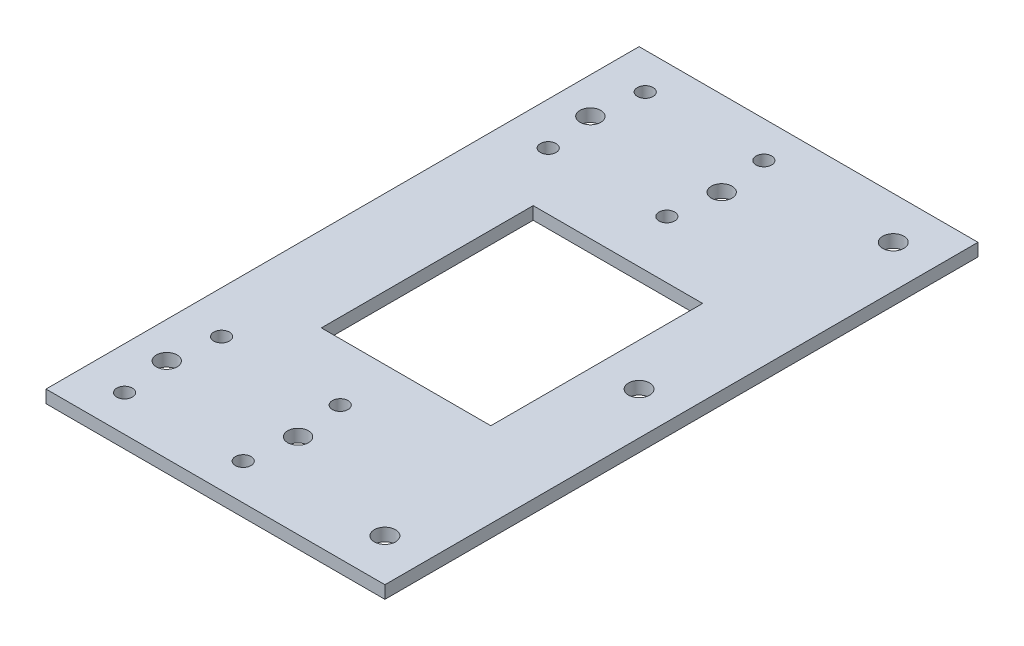
ISO-10303-21;
HEADER;
FILE_DESCRIPTION(('STEP AP214'),'2;1');
FILE_NAME('part.step','',(''),(''),'','','');
FILE_SCHEMA(('AUTOMOTIVE_DESIGN { 1 0 10303 214 1 1 1 1 }'));
ENDSEC;
DATA;
#1=APPLICATION_CONTEXT('core data for automotive mechanical design processes');
#2=APPLICATION_PROTOCOL_DEFINITION('international standard','automotive_design',2000,#1);
#3=PRODUCT_CONTEXT('',#1,'mechanical');
#4=PRODUCT('Part','Part','',(#3));
#5=PRODUCT_RELATED_PRODUCT_CATEGORY('part','',(#4));
#6=PRODUCT_DEFINITION_FORMATION('','',#4);
#7=PRODUCT_DEFINITION_CONTEXT('part definition',#1,'design');
#8=PRODUCT_DEFINITION('design','',#6,#7);
#9=PRODUCT_DEFINITION_SHAPE('','',#8);
#10=(LENGTH_UNIT() NAMED_UNIT(*) SI_UNIT(.MILLI.,.METRE.));
#11=(NAMED_UNIT(*) PLANE_ANGLE_UNIT() SI_UNIT($,.RADIAN.));
#12=(NAMED_UNIT(*) SI_UNIT($,.STERADIAN.) SOLID_ANGLE_UNIT());
#13=UNCERTAINTY_MEASURE_WITH_UNIT(LENGTH_MEASURE(1.E-05),#10,'distance_accuracy_value','');
#14=(GEOMETRIC_REPRESENTATION_CONTEXT(3) GLOBAL_UNCERTAINTY_ASSIGNED_CONTEXT((#13)) GLOBAL_UNIT_ASSIGNED_CONTEXT((#10,
#11,#12)) REPRESENTATION_CONTEXT('',''));
#15=CARTESIAN_POINT('',(0.,0.,0.));
#16=DIRECTION('',(0.,0.,1.));
#17=DIRECTION('',(1.,0.,0.));
#18=AXIS2_PLACEMENT_3D('',#15,#16,#17);
#19=CARTESIAN_POINT('',(40.,3.,0.));
#20=DIRECTION('',(-1.,0.,0.));
#21=DIRECTION('',(0.,0.,1.));
#22=AXIS2_PLACEMENT_3D('',#19,#20,#21);
#23=PLANE('',#22);
#24=DIRECTION('',(0.,0.,-1.));
#25=VECTOR('',#24,1.);
#26=CARTESIAN_POINT('',(40.,0.,0.));
#27=LINE('',#26,#25);
#28=CARTESIAN_POINT('',(40.,0.,70.));
#29=VERTEX_POINT('',#28);
#30=CARTESIAN_POINT('',(40.,0.,-70.));
#31=VERTEX_POINT('',#30);
#32=EDGE_CURVE('E250',#29,#31,#27,.T.);
#33=ORIENTED_EDGE('',*,*,#32,.T.);
#34=DIRECTION('',(0.,-1.,0.));
#35=VECTOR('',#34,1.);
#36=CARTESIAN_POINT('',(40.,3.,-70.));
#37=LINE('',#36,#35);
#38=CARTESIAN_POINT('',(40.,3.,-70.));
#39=VERTEX_POINT('',#38);
#40=EDGE_CURVE('E11',#39,#31,#37,.T.);
#41=ORIENTED_EDGE('',*,*,#40,.F.);
#42=DIRECTION('',(0.,0.,-1.));
#43=VECTOR('',#42,1.);
#44=CARTESIAN_POINT('',(40.,3.,0.));
#45=LINE('',#44,#43);
#46=CARTESIAN_POINT('',(40.,3.,70.));
#47=VERTEX_POINT('',#46);
#48=EDGE_CURVE('E176',#47,#39,#45,.T.);
#49=ORIENTED_EDGE('',*,*,#48,.F.);
#50=DIRECTION('',(0.,-1.,0.));
#51=VECTOR('',#50,1.);
#52=CARTESIAN_POINT('',(40.,3.,70.));
#53=LINE('',#52,#51);
#54=EDGE_CURVE('E234',#47,#29,#53,.T.);
#55=ORIENTED_EDGE('',*,*,#54,.T.);
#56=EDGE_LOOP('',(#33,#41,#49,#55));
#57=FACE_BOUND('',#56,.T.);
#58=ADVANCED_FACE('F46',(#57),#23,.F.);
#59=CARTESIAN_POINT('',(0.,3.,-70.));
#60=DIRECTION('',(0.,0.,-1.));
#61=DIRECTION('',(-1.,0.,0.));
#62=AXIS2_PLACEMENT_3D('',#59,#60,#61);
#63=PLANE('',#62);
#64=DIRECTION('',(1.,0.,0.));
#65=VECTOR('',#64,1.);
#66=CARTESIAN_POINT('',(0.,0.,-70.));
#67=LINE('',#66,#65);
#68=CARTESIAN_POINT('',(-40.,0.,-70.));
#69=VERTEX_POINT('',#68);
#70=EDGE_CURVE('E254',#69,#31,#67,.T.);
#71=ORIENTED_EDGE('',*,*,#70,.F.);
#72=DIRECTION('',(0.,-1.,0.));
#73=VECTOR('',#72,1.);
#74=CARTESIAN_POINT('',(-40.,3.,-70.));
#75=LINE('',#74,#73);
#76=CARTESIAN_POINT('',(-40.,3.,-70.));
#77=VERTEX_POINT('',#76);
#78=EDGE_CURVE('E55',#77,#69,#75,.T.);
#79=ORIENTED_EDGE('',*,*,#78,.F.);
#80=DIRECTION('',(1.,0.,0.));
#81=VECTOR('',#80,1.);
#82=CARTESIAN_POINT('',(0.,3.,-70.));
#83=LINE('',#82,#81);
#84=EDGE_CURVE('E179',#77,#39,#83,.T.);
#85=ORIENTED_EDGE('',*,*,#84,.T.);
#86=ORIENTED_EDGE('',*,*,#40,.T.);
#87=EDGE_LOOP('',(#71,#79,#85,#86));
#88=FACE_BOUND('',#87,.T.);
#89=ADVANCED_FACE('F321',(#88),#63,.T.);
#90=CARTESIAN_POINT('',(-40.,3.,0.));
#91=DIRECTION('',(-1.,0.,0.));
#92=DIRECTION('',(0.,0.,1.));
#93=AXIS2_PLACEMENT_3D('',#90,#91,#92);
#94=PLANE('',#93);
#95=DIRECTION('',(0.,0.,-1.));
#96=VECTOR('',#95,1.);
#97=CARTESIAN_POINT('',(-40.,0.,0.));
#98=LINE('',#97,#96);
#99=CARTESIAN_POINT('',(-40.,0.,70.));
#100=VERTEX_POINT('',#99);
#101=EDGE_CURVE('E258',#100,#69,#98,.T.);
#102=ORIENTED_EDGE('',*,*,#101,.F.);
#103=DIRECTION('',(0.,-1.,0.));
#104=VECTOR('',#103,1.);
#105=CARTESIAN_POINT('',(-40.,3.,70.));
#106=LINE('',#105,#104);
#107=CARTESIAN_POINT('',(-40.,3.,70.));
#108=VERTEX_POINT('',#107);
#109=EDGE_CURVE('E311',#108,#100,#106,.T.);
#110=ORIENTED_EDGE('',*,*,#109,.F.);
#111=DIRECTION('',(0.,0.,-1.));
#112=VECTOR('',#111,1.);
#113=CARTESIAN_POINT('',(-40.,3.,0.));
#114=LINE('',#113,#112);
#115=EDGE_CURVE('E183',#108,#77,#114,.T.);
#116=ORIENTED_EDGE('',*,*,#115,.T.);
#117=ORIENTED_EDGE('',*,*,#78,.T.);
#118=EDGE_LOOP('',(#102,#110,#116,#117));
#119=FACE_BOUND('',#118,.T.);
#120=ADVANCED_FACE('F317',(#119),#94,.T.);
#121=CARTESIAN_POINT('',(-0.499999999999992,3.,-50.));
#122=DIRECTION('',(0.,-1.,0.));
#123=DIRECTION('',(0.,0.,-1.));
#124=AXIS2_PLACEMENT_3D('',#121,#122,#123);
#125=CYLINDRICAL_SURFACE('',#124,2.45);
#126=CARTESIAN_POINT('',(-0.499999999999992,3.,-50.));
#127=DIRECTION('',(0.,1.,0.));
#128=DIRECTION('',(0.,0.,1.));
#129=AXIS2_PLACEMENT_3D('',#126,#127,#128);
#130=CIRCLE('',#129,2.45);
#131=CARTESIAN_POINT('',(-0.499999999999992,3.,-47.55));
#132=VERTEX_POINT('',#131);
#133=EDGE_CURVE('E226',#132,#132,#130,.T.);
#134=ORIENTED_EDGE('',*,*,#133,.T.);
#135=EDGE_LOOP('',(#134));
#136=FACE_BOUND('',#135,.T.);
#137=CARTESIAN_POINT('',(-0.499999999999992,0.,-50.));
#138=DIRECTION('',(0.,1.,0.));
#139=DIRECTION('',(0.,0.,1.));
#140=AXIS2_PLACEMENT_3D('',#137,#138,#139);
#141=CIRCLE('',#140,2.45);
#142=CARTESIAN_POINT('',(-0.499999999999992,0.,-47.55));
#143=VERTEX_POINT('',#142);
#144=EDGE_CURVE('E301',#143,#143,#141,.T.);
#145=ORIENTED_EDGE('',*,*,#144,.F.);
#146=EDGE_LOOP('',(#145));
#147=FACE_BOUND('',#146,.T.);
#148=ADVANCED_FACE('F592',(#136,#147),#125,.F.);
#149=CARTESIAN_POINT('',(-2.00000000000001,3.,-61.45));
#150=DIRECTION('',(0.,-1.,0.));
#151=DIRECTION('',(0.,0.,-1.));
#152=AXIS2_PLACEMENT_3D('',#149,#150,#151);
#153=CYLINDRICAL_SURFACE('',#152,1.85);
#154=CARTESIAN_POINT('',(-2.00000000000001,3.,-61.45));
#155=DIRECTION('',(0.,1.,0.));
#156=DIRECTION('',(0.,0.,1.));
#157=AXIS2_PLACEMENT_3D('',#154,#155,#156);
#158=CIRCLE('',#157,1.85);
#159=CARTESIAN_POINT('',(-2.00000000000001,3.,-59.6));
#160=VERTEX_POINT('',#159);
#161=EDGE_CURVE('E222',#160,#160,#158,.F.);
#162=ORIENTED_EDGE('',*,*,#161,.F.);
#163=EDGE_LOOP('',(#162));
#164=FACE_BOUND('',#163,.T.);
#165=CARTESIAN_POINT('',(-2.00000000000001,0.,-61.45));
#166=DIRECTION('',(0.,1.,0.));
#167=DIRECTION('',(0.,0.,1.));
#168=AXIS2_PLACEMENT_3D('',#165,#166,#167);
#169=CIRCLE('',#168,1.85);
#170=CARTESIAN_POINT('',(-2.00000000000001,0.,-59.6));
#171=VERTEX_POINT('',#170);
#172=EDGE_CURVE('E297',#171,#171,#169,.F.);
#173=ORIENTED_EDGE('',*,*,#172,.T.);
#174=EDGE_LOOP('',(#173));
#175=FACE_BOUND('',#174,.T.);
#176=ADVANCED_FACE('F583',(#164,#175),#153,.F.);
#177=CARTESIAN_POINT('',(-2.00000000000001,3.,-38.55));
#178=DIRECTION('',(0.,-1.,0.));
#179=DIRECTION('',(0.,0.,-1.));
#180=AXIS2_PLACEMENT_3D('',#177,#178,#179);
#181=CYLINDRICAL_SURFACE('',#180,1.85);
#182=CARTESIAN_POINT('',(-2.00000000000001,3.,-38.55));
#183=DIRECTION('',(0.,1.,0.));
#184=DIRECTION('',(0.,0.,1.));
#185=AXIS2_PLACEMENT_3D('',#182,#183,#184);
#186=CIRCLE('',#185,1.85);
#187=CARTESIAN_POINT('',(-2.00000000000001,3.,-36.7));
#188=VERTEX_POINT('',#187);
#189=EDGE_CURVE('E218',#188,#188,#186,.T.);
#190=ORIENTED_EDGE('',*,*,#189,.T.);
#191=EDGE_LOOP('',(#190));
#192=FACE_BOUND('',#191,.T.);
#193=CARTESIAN_POINT('',(-2.00000000000001,0.,-38.55));
#194=DIRECTION('',(0.,1.,0.));
#195=DIRECTION('',(0.,0.,1.));
#196=AXIS2_PLACEMENT_3D('',#193,#194,#195);
#197=CIRCLE('',#196,1.85);
#198=CARTESIAN_POINT('',(-2.00000000000001,0.,-36.7));
#199=VERTEX_POINT('',#198);
#200=EDGE_CURVE('E293',#199,#199,#197,.T.);
#201=ORIENTED_EDGE('',*,*,#200,.F.);
#202=EDGE_LOOP('',(#201));
#203=FACE_BOUND('',#202,.T.);
#204=ADVANCED_FACE('F574',(#192,#203),#181,.F.);
#205=CARTESIAN_POINT('',(-30.,3.,-38.55));
#206=DIRECTION('',(0.,-1.,0.));
#207=DIRECTION('',(0.,0.,-1.));
#208=AXIS2_PLACEMENT_3D('',#205,#206,#207);
#209=CYLINDRICAL_SURFACE('',#208,1.85);
#210=CARTESIAN_POINT('',(-30.,3.,-38.55));
#211=DIRECTION('',(0.,1.,0.));
#212=DIRECTION('',(0.,0.,1.));
#213=AXIS2_PLACEMENT_3D('',#210,#211,#212);
#214=CIRCLE('',#213,1.85);
#215=CARTESIAN_POINT('',(-30.,3.,-36.7));
#216=VERTEX_POINT('',#215);
#217=EDGE_CURVE('E214',#216,#216,#214,.F.);
#218=ORIENTED_EDGE('',*,*,#217,.F.);
#219=EDGE_LOOP('',(#218));
#220=FACE_BOUND('',#219,.T.);
#221=CARTESIAN_POINT('',(-30.,0.,-38.55));
#222=DIRECTION('',(0.,1.,0.));
#223=DIRECTION('',(0.,0.,1.));
#224=AXIS2_PLACEMENT_3D('',#221,#222,#223);
#225=CIRCLE('',#224,1.85);
#226=CARTESIAN_POINT('',(-30.,0.,-36.7));
#227=VERTEX_POINT('',#226);
#228=EDGE_CURVE('E289',#227,#227,#225,.F.);
#229=ORIENTED_EDGE('',*,*,#228,.T.);
#230=EDGE_LOOP('',(#229));
#231=FACE_BOUND('',#230,.T.);
#232=ADVANCED_FACE('F565',(#220,#231),#209,.F.);
#233=CARTESIAN_POINT('',(-30.,3.,61.4500000000001));
#234=DIRECTION('',(0.,-1.,0.));
#235=DIRECTION('',(0.,0.,-1.));
#236=AXIS2_PLACEMENT_3D('',#233,#234,#235);
#237=CYLINDRICAL_SURFACE('',#236,1.85);
#238=CARTESIAN_POINT('',(-30.,3.,61.4500000000001));
#239=DIRECTION('',(0.,1.,0.));
#240=DIRECTION('',(0.,0.,1.));
#241=AXIS2_PLACEMENT_3D('',#238,#239,#240);
#242=CIRCLE('',#241,1.85);
#243=CARTESIAN_POINT('',(-30.,3.,63.3000000000001));
#244=VERTEX_POINT('',#243);
#245=EDGE_CURVE('E210',#244,#244,#242,.F.);
#246=ORIENTED_EDGE('',*,*,#245,.F.);
#247=EDGE_LOOP('',(#246));
#248=FACE_BOUND('',#247,.T.);
#249=CARTESIAN_POINT('',(-30.,0.,61.4500000000001));
#250=DIRECTION('',(0.,1.,0.));
#251=DIRECTION('',(0.,0.,1.));
#252=AXIS2_PLACEMENT_3D('',#249,#250,#251);
#253=CIRCLE('',#252,1.85);
#254=CARTESIAN_POINT('',(-30.,0.,63.3000000000001));
#255=VERTEX_POINT('',#254);
#256=EDGE_CURVE('E285',#255,#255,#253,.F.);
#257=ORIENTED_EDGE('',*,*,#256,.T.);
#258=EDGE_LOOP('',(#257));
#259=FACE_BOUND('',#258,.T.);
#260=ADVANCED_FACE('F556',(#248,#259),#237,.F.);
#261=CARTESIAN_POINT('',(-31.5,3.,50.));
#262=DIRECTION('',(0.,-1.,0.));
#263=DIRECTION('',(0.,0.,-1.));
#264=AXIS2_PLACEMENT_3D('',#261,#262,#263);
#265=CYLINDRICAL_SURFACE('',#264,2.45);
#266=CARTESIAN_POINT('',(-31.5,3.,50.));
#267=DIRECTION('',(0.,1.,0.));
#268=DIRECTION('',(0.,0.,1.));
#269=AXIS2_PLACEMENT_3D('',#266,#267,#268);
#270=CIRCLE('',#269,2.45);
#271=CARTESIAN_POINT('',(-31.5,3.,52.4500000000001));
#272=VERTEX_POINT('',#271);
#273=EDGE_CURVE('E206',#272,#272,#270,.T.);
#274=ORIENTED_EDGE('',*,*,#273,.T.);
#275=EDGE_LOOP('',(#274));
#276=FACE_BOUND('',#275,.T.);
#277=CARTESIAN_POINT('',(-31.5,0.,50.));
#278=DIRECTION('',(0.,1.,0.));
#279=DIRECTION('',(0.,0.,1.));
#280=AXIS2_PLACEMENT_3D('',#277,#278,#279);
#281=CIRCLE('',#280,2.45);
#282=CARTESIAN_POINT('',(-31.5,0.,52.4500000000001));
#283=VERTEX_POINT('',#282);
#284=EDGE_CURVE('E281',#283,#283,#281,.T.);
#285=ORIENTED_EDGE('',*,*,#284,.F.);
#286=EDGE_LOOP('',(#285));
#287=FACE_BOUND('',#286,.T.);
#288=ADVANCED_FACE('F547',(#276,#287),#265,.F.);
#289=CARTESIAN_POINT('',(-30.,3.,38.55));
#290=DIRECTION('',(0.,-1.,0.));
#291=DIRECTION('',(0.,0.,-1.));
#292=AXIS2_PLACEMENT_3D('',#289,#290,#291);
#293=CYLINDRICAL_SURFACE('',#292,1.85);
#294=CARTESIAN_POINT('',(-30.,3.,38.55));
#295=DIRECTION('',(0.,1.,0.));
#296=DIRECTION('',(0.,0.,1.));
#297=AXIS2_PLACEMENT_3D('',#294,#295,#296);
#298=CIRCLE('',#297,1.85);
#299=CARTESIAN_POINT('',(-30.,3.,40.4));
#300=VERTEX_POINT('',#299);
#301=EDGE_CURVE('E202',#300,#300,#298,.T.);
#302=ORIENTED_EDGE('',*,*,#301,.T.);
#303=EDGE_LOOP('',(#302));
#304=FACE_BOUND('',#303,.T.);
#305=CARTESIAN_POINT('',(-30.,0.,38.55));
#306=DIRECTION('',(0.,1.,0.));
#307=DIRECTION('',(0.,0.,1.));
#308=AXIS2_PLACEMENT_3D('',#305,#306,#307);
#309=CIRCLE('',#308,1.85);
#310=CARTESIAN_POINT('',(-30.,0.,40.4));
#311=VERTEX_POINT('',#310);
#312=EDGE_CURVE('E277',#311,#311,#309,.T.);
#313=ORIENTED_EDGE('',*,*,#312,.F.);
#314=EDGE_LOOP('',(#313));
#315=FACE_BOUND('',#314,.T.);
#316=ADVANCED_FACE('F538',(#304,#315),#293,.F.);
#317=CARTESIAN_POINT('',(-2.00000000000001,3.,61.4500000000001));
#318=DIRECTION('',(0.,-1.,0.));
#319=DIRECTION('',(0.,0.,-1.));
#320=AXIS2_PLACEMENT_3D('',#317,#318,#319);
#321=CYLINDRICAL_SURFACE('',#320,1.85);
#322=CARTESIAN_POINT('',(-2.00000000000001,3.,61.4500000000001));
#323=DIRECTION('',(0.,1.,0.));
#324=DIRECTION('',(0.,0.,1.));
#325=AXIS2_PLACEMENT_3D('',#322,#323,#324);
#326=CIRCLE('',#325,1.85);
#327=CARTESIAN_POINT('',(-2.00000000000001,3.,63.3000000000001));
#328=VERTEX_POINT('',#327);
#329=EDGE_CURVE('E198',#328,#328,#326,.T.);
#330=ORIENTED_EDGE('',*,*,#329,.T.);
#331=EDGE_LOOP('',(#330));
#332=FACE_BOUND('',#331,.T.);
#333=CARTESIAN_POINT('',(-2.00000000000001,0.,61.4500000000001));
#334=DIRECTION('',(0.,1.,0.));
#335=DIRECTION('',(0.,0.,1.));
#336=AXIS2_PLACEMENT_3D('',#333,#334,#335);
#337=CIRCLE('',#336,1.85);
#338=CARTESIAN_POINT('',(-2.00000000000001,0.,63.3000000000001));
#339=VERTEX_POINT('',#338);
#340=EDGE_CURVE('E273',#339,#339,#337,.T.);
#341=ORIENTED_EDGE('',*,*,#340,.F.);
#342=EDGE_LOOP('',(#341));
#343=FACE_BOUND('',#342,.T.);
#344=ADVANCED_FACE('F529',(#332,#343),#321,.F.);
#345=CARTESIAN_POINT('',(-2.00000000000001,3.,38.55));
#346=DIRECTION('',(0.,-1.,0.));
#347=DIRECTION('',(0.,0.,-1.));
#348=AXIS2_PLACEMENT_3D('',#345,#346,#347);
#349=CYLINDRICAL_SURFACE('',#348,1.85);
#350=CARTESIAN_POINT('',(-2.00000000000001,3.,38.55));
#351=DIRECTION('',(0.,1.,0.));
#352=DIRECTION('',(0.,0.,1.));
#353=AXIS2_PLACEMENT_3D('',#350,#351,#352);
#354=CIRCLE('',#353,1.85);
#355=CARTESIAN_POINT('',(-2.00000000000001,3.,40.4));
#356=VERTEX_POINT('',#355);
#357=EDGE_CURVE('E194',#356,#356,#354,.F.);
#358=ORIENTED_EDGE('',*,*,#357,.F.);
#359=EDGE_LOOP('',(#358));
#360=FACE_BOUND('',#359,.T.);
#361=CARTESIAN_POINT('',(-2.00000000000001,0.,38.55));
#362=DIRECTION('',(0.,1.,0.));
#363=DIRECTION('',(0.,0.,1.));
#364=AXIS2_PLACEMENT_3D('',#361,#362,#363);
#365=CIRCLE('',#364,1.85);
#366=CARTESIAN_POINT('',(-2.00000000000001,0.,40.4));
#367=VERTEX_POINT('',#366);
#368=EDGE_CURVE('E269',#367,#367,#365,.F.);
#369=ORIENTED_EDGE('',*,*,#368,.T.);
#370=EDGE_LOOP('',(#369));
#371=FACE_BOUND('',#370,.T.);
#372=ADVANCED_FACE('F520',(#360,#371),#349,.F.);
#373=CARTESIAN_POINT('',(-0.499999999999992,3.,50.));
#374=DIRECTION('',(0.,-1.,0.));
#375=DIRECTION('',(0.,0.,-1.));
#376=AXIS2_PLACEMENT_3D('',#373,#374,#375);
#377=CYLINDRICAL_SURFACE('',#376,2.45);
#378=CARTESIAN_POINT('',(-0.499999999999992,3.,50.));
#379=DIRECTION('',(0.,1.,0.));
#380=DIRECTION('',(0.,0.,1.));
#381=AXIS2_PLACEMENT_3D('',#378,#379,#380);
#382=CIRCLE('',#381,2.45);
#383=CARTESIAN_POINT('',(-0.499999999999992,3.,52.4500000000001));
#384=VERTEX_POINT('',#383);
#385=EDGE_CURVE('E190',#384,#384,#382,.F.);
#386=ORIENTED_EDGE('',*,*,#385,.F.);
#387=EDGE_LOOP('',(#386));
#388=FACE_BOUND('',#387,.T.);
#389=CARTESIAN_POINT('',(-0.499999999999992,0.,50.));
#390=DIRECTION('',(0.,1.,0.));
#391=DIRECTION('',(0.,0.,1.));
#392=AXIS2_PLACEMENT_3D('',#389,#390,#391);
#393=CIRCLE('',#392,2.45);
#394=CARTESIAN_POINT('',(-0.499999999999992,0.,52.4500000000001));
#395=VERTEX_POINT('',#394);
#396=EDGE_CURVE('E265',#395,#395,#393,.F.);
#397=ORIENTED_EDGE('',*,*,#396,.T.);
#398=EDGE_LOOP('',(#397));
#399=FACE_BOUND('',#398,.T.);
#400=ADVANCED_FACE('F512',(#388,#399),#377,.F.);
#401=CARTESIAN_POINT('',(0.,3.,70.));
#402=DIRECTION('',(0.,0.,-1.));
#403=DIRECTION('',(-1.,0.,0.));
#404=AXIS2_PLACEMENT_3D('',#401,#402,#403);
#405=PLANE('',#404);
#406=DIRECTION('',(1.,0.,0.));
#407=VECTOR('',#406,1.);
#408=CARTESIAN_POINT('',(0.,0.,70.));
#409=LINE('',#408,#407);
#410=EDGE_CURVE('E262',#100,#29,#409,.T.);
#411=ORIENTED_EDGE('',*,*,#410,.T.);
#412=ORIENTED_EDGE('',*,*,#54,.F.);
#413=DIRECTION('',(1.,0.,0.));
#414=VECTOR('',#413,1.);
#415=CARTESIAN_POINT('',(0.,3.,70.));
#416=LINE('',#415,#414);
#417=EDGE_CURVE('E187',#108,#47,#416,.T.);
#418=ORIENTED_EDGE('',*,*,#417,.F.);
#419=ORIENTED_EDGE('',*,*,#109,.T.);
#420=EDGE_LOOP('',(#411,#412,#418,#419));
#421=FACE_BOUND('',#420,.T.);
#422=ADVANCED_FACE('F329',(#421),#405,.F.);
#423=CARTESIAN_POINT('',(30.0000000000006,3.,0.));
#424=DIRECTION('',(0.,-1.,0.));
#425=DIRECTION('',(0.,0.,-1.));
#426=AXIS2_PLACEMENT_3D('',#423,#424,#425);
#427=CYLINDRICAL_SURFACE('',#426,2.5);
#428=CARTESIAN_POINT('',(30.0000000000006,3.,0.));
#429=DIRECTION('',(0.,1.,0.));
#430=DIRECTION('',(0.,0.,1.));
#431=AXIS2_PLACEMENT_3D('',#428,#429,#430);
#432=CIRCLE('',#431,2.5);
#433=CARTESIAN_POINT('',(30.0000000000006,3.,2.49999999999999));
#434=VERTEX_POINT('',#433);
#435=EDGE_CURVE('E172',#434,#434,#432,.T.);
#436=ORIENTED_EDGE('',*,*,#435,.T.);
#437=EDGE_LOOP('',(#436));
#438=FACE_BOUND('',#437,.T.);
#439=CARTESIAN_POINT('',(30.0000000000006,0.,0.));
#440=DIRECTION('',(0.,1.,0.));
#441=DIRECTION('',(0.,0.,1.));
#442=AXIS2_PLACEMENT_3D('',#439,#440,#441);
#443=CIRCLE('',#442,2.5);
#444=CARTESIAN_POINT('',(30.0000000000006,0.,2.49999999999999));
#445=VERTEX_POINT('',#444);
#446=EDGE_CURVE('E246',#445,#445,#443,.T.);
#447=ORIENTED_EDGE('',*,*,#446,.F.);
#448=EDGE_LOOP('',(#447));
#449=FACE_BOUND('',#448,.T.);
#450=ADVANCED_FACE('F382',(#438,#449),#427,.F.);
#451=CARTESIAN_POINT('',(30.0000000000012,3.,60.));
#452=DIRECTION('',(0.,-1.,0.));
#453=DIRECTION('',(0.,0.,-1.));
#454=AXIS2_PLACEMENT_3D('',#451,#452,#453);
#455=CYLINDRICAL_SURFACE('',#454,2.5);
#456=CARTESIAN_POINT('',(30.0000000000012,3.,60.));
#457=DIRECTION('',(0.,1.,0.));
#458=DIRECTION('',(0.,0.,1.));
#459=AXIS2_PLACEMENT_3D('',#456,#457,#458);
#460=CIRCLE('',#459,2.5);
#461=CARTESIAN_POINT('',(30.0000000000012,3.,62.5));
#462=VERTEX_POINT('',#461);
#463=EDGE_CURVE('E168',#462,#462,#460,.T.);
#464=ORIENTED_EDGE('',*,*,#463,.T.);
#465=EDGE_LOOP('',(#464));
#466=FACE_BOUND('',#465,.T.);
#467=CARTESIAN_POINT('',(30.0000000000012,0.,60.));
#468=DIRECTION('',(0.,1.,0.));
#469=DIRECTION('',(0.,0.,1.));
#470=AXIS2_PLACEMENT_3D('',#467,#468,#469);
#471=CIRCLE('',#470,2.5);
#472=CARTESIAN_POINT('',(30.0000000000012,0.,62.5));
#473=VERTEX_POINT('',#472);
#474=EDGE_CURVE('E242',#473,#473,#471,.T.);
#475=ORIENTED_EDGE('',*,*,#474,.F.);
#476=EDGE_LOOP('',(#475));
#477=FACE_BOUND('',#476,.T.);
#478=ADVANCED_FACE('F385',(#466,#477),#455,.F.);
#479=CARTESIAN_POINT('',(30.,3.,-60.));
#480=DIRECTION('',(0.,-1.,0.));
#481=DIRECTION('',(0.,0.,-1.));
#482=AXIS2_PLACEMENT_3D('',#479,#480,#481);
#483=CYLINDRICAL_SURFACE('',#482,2.5);
#484=CARTESIAN_POINT('',(30.,3.,-60.));
#485=DIRECTION('',(0.,1.,0.));
#486=DIRECTION('',(0.,0.,1.));
#487=AXIS2_PLACEMENT_3D('',#484,#485,#486);
#488=CIRCLE('',#487,2.5);
#489=CARTESIAN_POINT('',(30.,3.,-57.5));
#490=VERTEX_POINT('',#489);
#491=EDGE_CURVE('E163',#490,#490,#488,.T.);
#492=ORIENTED_EDGE('',*,*,#491,.T.);
#493=EDGE_LOOP('',(#492));
#494=FACE_BOUND('',#493,.T.);
#495=CARTESIAN_POINT('',(30.,0.,-60.));
#496=DIRECTION('',(0.,1.,0.));
#497=DIRECTION('',(0.,0.,1.));
#498=AXIS2_PLACEMENT_3D('',#495,#496,#497);
#499=CIRCLE('',#498,2.5);
#500=CARTESIAN_POINT('',(30.,0.,-57.5));
#501=VERTEX_POINT('',#500);
#502=EDGE_CURVE('E238',#501,#501,#499,.T.);
#503=ORIENTED_EDGE('',*,*,#502,.F.);
#504=EDGE_LOOP('',(#503));
#505=FACE_BOUND('',#504,.T.);
#506=ADVANCED_FACE('F388',(#494,#505),#483,.F.);
#507=CARTESIAN_POINT('',(-30.,3.,-61.45));
#508=DIRECTION('',(0.,-1.,0.));
#509=DIRECTION('',(0.,0.,-1.));
#510=AXIS2_PLACEMENT_3D('',#507,#508,#509);
#511=CYLINDRICAL_SURFACE('',#510,1.85);
#512=CARTESIAN_POINT('',(-30.,3.,-61.45));
#513=DIRECTION('',(0.,1.,0.));
#514=DIRECTION('',(0.,0.,1.));
#515=AXIS2_PLACEMENT_3D('',#512,#513,#514);
#516=CIRCLE('',#515,1.85);
#517=CARTESIAN_POINT('',(-30.,3.,-59.6));
#518=VERTEX_POINT('',#517);
#519=EDGE_CURVE('E159',#518,#518,#516,.T.);
#520=ORIENTED_EDGE('',*,*,#519,.T.);
#521=EDGE_LOOP('',(#520));
#522=FACE_BOUND('',#521,.T.);
#523=CARTESIAN_POINT('',(-30.,0.,-61.45));
#524=DIRECTION('',(0.,1.,0.));
#525=DIRECTION('',(0.,0.,1.));
#526=AXIS2_PLACEMENT_3D('',#523,#524,#525);
#527=CIRCLE('',#526,1.85);
#528=CARTESIAN_POINT('',(-30.,0.,-59.6));
#529=VERTEX_POINT('',#528);
#530=EDGE_CURVE('E127',#529,#529,#527,.T.);
#531=ORIENTED_EDGE('',*,*,#530,.F.);
#532=EDGE_LOOP('',(#531));
#533=FACE_BOUND('',#532,.T.);
#534=ADVANCED_FACE('F48',(#522,#533),#511,.F.);
#535=CARTESIAN_POINT('',(-31.5,3.,-50.));
#536=DIRECTION('',(0.,-1.,0.));
#537=DIRECTION('',(0.,0.,-1.));
#538=AXIS2_PLACEMENT_3D('',#535,#536,#537);
#539=CYLINDRICAL_SURFACE('',#538,2.45);
#540=CARTESIAN_POINT('',(-31.5,3.,-50.));
#541=DIRECTION('',(0.,1.,0.));
#542=DIRECTION('',(0.,0.,1.));
#543=AXIS2_PLACEMENT_3D('',#540,#541,#542);
#544=CIRCLE('',#543,2.45);
#545=CARTESIAN_POINT('',(-31.5,3.,-47.55));
#546=VERTEX_POINT('',#545);
#547=EDGE_CURVE('E230',#546,#546,#544,.F.);
#548=ORIENTED_EDGE('',*,*,#547,.F.);
#549=EDGE_LOOP('',(#548));
#550=FACE_BOUND('',#549,.T.);
#551=CARTESIAN_POINT('',(-31.5,0.,-50.));
#552=DIRECTION('',(0.,1.,0.));
#553=DIRECTION('',(0.,0.,1.));
#554=AXIS2_PLACEMENT_3D('',#551,#552,#553);
#555=CIRCLE('',#554,2.45);
#556=CARTESIAN_POINT('',(-31.5,0.,-47.55));
#557=VERTEX_POINT('',#556);
#558=EDGE_CURVE('E164',#557,#557,#555,.F.);
#559=ORIENTED_EDGE('',*,*,#558,.T.);
#560=EDGE_LOOP('',(#559));
#561=FACE_BOUND('',#560,.T.);
#562=ADVANCED_FACE('F337',(#550,#561),#539,.F.);
#563=CARTESIAN_POINT('',(0.,3.,0.));
#564=DIRECTION('',(0.,1.,0.));
#565=DIRECTION('',(0.,0.,1.));
#566=AXIS2_PLACEMENT_3D('',#563,#564,#565);
#567=PLANE('',#566);
#568=DIRECTION('',(0.,0.,1.));
#569=VECTOR('',#568,1.);
#570=CARTESIAN_POINT('',(-20.,3.,25.));
#571=LINE('',#570,#569);
#572=CARTESIAN_POINT('',(-20.,3.,-25.));
#573=VERTEX_POINT('',#572);
#574=CARTESIAN_POINT('',(-20.,3.,25.));
#575=VERTEX_POINT('',#574);
#576=EDGE_CURVE('E62',#573,#575,#571,.T.);
#577=ORIENTED_EDGE('',*,*,#576,.F.);
#578=DIRECTION('',(-1.,0.,0.));
#579=VECTOR('',#578,1.);
#580=CARTESIAN_POINT('',(20.,3.,-25.));
#581=LINE('',#580,#579);
#582=CARTESIAN_POINT('',(20.,3.,-25.));
#583=VERTEX_POINT('',#582);
#584=EDGE_CURVE('E120',#583,#573,#581,.T.);
#585=ORIENTED_EDGE('',*,*,#584,.F.);
#586=DIRECTION('',(0.,0.,-1.));
#587=VECTOR('',#586,1.);
#588=CARTESIAN_POINT('',(20.,3.,25.));
#589=LINE('',#588,#587);
#590=CARTESIAN_POINT('',(20.,3.,25.));
#591=VERTEX_POINT('',#590);
#592=EDGE_CURVE('E145',#591,#583,#589,.T.);
#593=ORIENTED_EDGE('',*,*,#592,.F.);
#594=DIRECTION('',(1.,0.,0.));
#595=VECTOR('',#594,1.);
#596=CARTESIAN_POINT('',(20.,3.,25.));
#597=LINE('',#596,#595);
#598=EDGE_CURVE('E138',#575,#591,#597,.T.);
#599=ORIENTED_EDGE('',*,*,#598,.F.);
#600=EDGE_LOOP('',(#577,#585,#593,#599));
#601=FACE_BOUND('',#600,.T.);
#602=ORIENTED_EDGE('',*,*,#519,.F.);
#603=EDGE_LOOP('',(#602));
#604=FACE_BOUND('',#603,.T.);
#605=ORIENTED_EDGE('',*,*,#491,.F.);
#606=EDGE_LOOP('',(#605));
#607=FACE_BOUND('',#606,.T.);
#608=ORIENTED_EDGE('',*,*,#463,.F.);
#609=EDGE_LOOP('',(#608));
#610=FACE_BOUND('',#609,.T.);
#611=ORIENTED_EDGE('',*,*,#435,.F.);
#612=EDGE_LOOP('',(#611));
#613=FACE_BOUND('',#612,.T.);
#614=ORIENTED_EDGE('',*,*,#48,.T.);
#615=ORIENTED_EDGE('',*,*,#84,.F.);
#616=ORIENTED_EDGE('',*,*,#115,.F.);
#617=ORIENTED_EDGE('',*,*,#417,.T.);
#618=EDGE_LOOP('',(#614,#615,#616,#617));
#619=FACE_BOUND('',#618,.T.);
#620=ORIENTED_EDGE('',*,*,#385,.T.);
#621=EDGE_LOOP('',(#620));
#622=FACE_BOUND('',#621,.T.);
#623=ORIENTED_EDGE('',*,*,#357,.T.);
#624=EDGE_LOOP('',(#623));
#625=FACE_BOUND('',#624,.T.);
#626=ORIENTED_EDGE('',*,*,#329,.F.);
#627=EDGE_LOOP('',(#626));
#628=FACE_BOUND('',#627,.T.);
#629=ORIENTED_EDGE('',*,*,#301,.F.);
#630=EDGE_LOOP('',(#629));
#631=FACE_BOUND('',#630,.T.);
#632=ORIENTED_EDGE('',*,*,#273,.F.);
#633=EDGE_LOOP('',(#632));
#634=FACE_BOUND('',#633,.T.);
#635=ORIENTED_EDGE('',*,*,#245,.T.);
#636=EDGE_LOOP('',(#635));
#637=FACE_BOUND('',#636,.T.);
#638=ORIENTED_EDGE('',*,*,#217,.T.);
#639=EDGE_LOOP('',(#638));
#640=FACE_BOUND('',#639,.T.);
#641=ORIENTED_EDGE('',*,*,#189,.F.);
#642=EDGE_LOOP('',(#641));
#643=FACE_BOUND('',#642,.T.);
#644=ORIENTED_EDGE('',*,*,#161,.T.);
#645=EDGE_LOOP('',(#644));
#646=FACE_BOUND('',#645,.T.);
#647=ORIENTED_EDGE('',*,*,#133,.F.);
#648=EDGE_LOOP('',(#647));
#649=FACE_BOUND('',#648,.T.);
#650=ORIENTED_EDGE('',*,*,#547,.T.);
#651=EDGE_LOOP('',(#650));
#652=FACE_BOUND('',#651,.T.);
#653=ADVANCED_FACE('F334',(#601,#604,#607,#610,#613,#619,#622,#625,#628,#631,#634,#637,#640,
#643,#646,#649,#652),#567,.T.);
#654=CARTESIAN_POINT('',(0.,0.,0.));
#655=DIRECTION('',(0.,1.,0.));
#656=DIRECTION('',(0.,0.,1.));
#657=AXIS2_PLACEMENT_3D('',#654,#655,#656);
#658=PLANE('',#657);
#659=DIRECTION('',(1.,0.,0.));
#660=VECTOR('',#659,1.);
#661=CARTESIAN_POINT('',(20.,0.,-25.));
#662=LINE('',#661,#660);
#663=CARTESIAN_POINT('',(-20.,0.,-25.));
#664=VERTEX_POINT('',#663);
#665=CARTESIAN_POINT('',(20.,0.,-25.));
#666=VERTEX_POINT('',#665);
#667=EDGE_CURVE('E133',#664,#666,#662,.T.);
#668=ORIENTED_EDGE('',*,*,#667,.F.);
#669=DIRECTION('',(0.,0.,-1.));
#670=VECTOR('',#669,1.);
#671=CARTESIAN_POINT('',(-20.,0.,25.));
#672=LINE('',#671,#670);
#673=CARTESIAN_POINT('',(-20.,0.,25.));
#674=VERTEX_POINT('',#673);
#675=EDGE_CURVE('E113',#674,#664,#672,.T.);
#676=ORIENTED_EDGE('',*,*,#675,.F.);
#677=DIRECTION('',(-1.,0.,0.));
#678=VECTOR('',#677,1.);
#679=CARTESIAN_POINT('',(20.,0.,25.));
#680=LINE('',#679,#678);
#681=CARTESIAN_POINT('',(20.,0.,25.));
#682=VERTEX_POINT('',#681);
#683=EDGE_CURVE('E123',#682,#674,#680,.T.);
#684=ORIENTED_EDGE('',*,*,#683,.F.);
#685=DIRECTION('',(0.,0.,1.));
#686=VECTOR('',#685,1.);
#687=CARTESIAN_POINT('',(20.,0.,25.));
#688=LINE('',#687,#686);
#689=EDGE_CURVE('E70',#666,#682,#688,.T.);
#690=ORIENTED_EDGE('',*,*,#689,.F.);
#691=EDGE_LOOP('',(#668,#676,#684,#690));
#692=FACE_BOUND('',#691,.T.);
#693=ORIENTED_EDGE('',*,*,#530,.T.);
#694=EDGE_LOOP('',(#693));
#695=FACE_BOUND('',#694,.T.);
#696=ORIENTED_EDGE('',*,*,#502,.T.);
#697=EDGE_LOOP('',(#696));
#698=FACE_BOUND('',#697,.T.);
#699=ORIENTED_EDGE('',*,*,#474,.T.);
#700=EDGE_LOOP('',(#699));
#701=FACE_BOUND('',#700,.T.);
#702=ORIENTED_EDGE('',*,*,#446,.T.);
#703=EDGE_LOOP('',(#702));
#704=FACE_BOUND('',#703,.T.);
#705=ORIENTED_EDGE('',*,*,#32,.F.);
#706=ORIENTED_EDGE('',*,*,#410,.F.);
#707=ORIENTED_EDGE('',*,*,#101,.T.);
#708=ORIENTED_EDGE('',*,*,#70,.T.);
#709=EDGE_LOOP('',(#705,#706,#707,#708));
#710=FACE_BOUND('',#709,.T.);
#711=ORIENTED_EDGE('',*,*,#396,.F.);
#712=EDGE_LOOP('',(#711));
#713=FACE_BOUND('',#712,.T.);
#714=ORIENTED_EDGE('',*,*,#368,.F.);
#715=EDGE_LOOP('',(#714));
#716=FACE_BOUND('',#715,.T.);
#717=ORIENTED_EDGE('',*,*,#340,.T.);
#718=EDGE_LOOP('',(#717));
#719=FACE_BOUND('',#718,.T.);
#720=ORIENTED_EDGE('',*,*,#312,.T.);
#721=EDGE_LOOP('',(#720));
#722=FACE_BOUND('',#721,.T.);
#723=ORIENTED_EDGE('',*,*,#284,.T.);
#724=EDGE_LOOP('',(#723));
#725=FACE_BOUND('',#724,.T.);
#726=ORIENTED_EDGE('',*,*,#256,.F.);
#727=EDGE_LOOP('',(#726));
#728=FACE_BOUND('',#727,.T.);
#729=ORIENTED_EDGE('',*,*,#228,.F.);
#730=EDGE_LOOP('',(#729));
#731=FACE_BOUND('',#730,.T.);
#732=ORIENTED_EDGE('',*,*,#200,.T.);
#733=EDGE_LOOP('',(#732));
#734=FACE_BOUND('',#733,.T.);
#735=ORIENTED_EDGE('',*,*,#172,.F.);
#736=EDGE_LOOP('',(#735));
#737=FACE_BOUND('',#736,.T.);
#738=ORIENTED_EDGE('',*,*,#144,.T.);
#739=EDGE_LOOP('',(#738));
#740=FACE_BOUND('',#739,.T.);
#741=ORIENTED_EDGE('',*,*,#558,.F.);
#742=EDGE_LOOP('',(#741));
#743=FACE_BOUND('',#742,.T.);
#744=ADVANCED_FACE('F130',(#692,#695,#698,#701,#704,#710,#713,#716,#719,#722,#725,#728,#731,
#734,#737,#740,#743),#658,.F.);
#745=CARTESIAN_POINT('',(-20.,-0.00100000000000013,25.));
#746=DIRECTION('',(-1.,0.,0.));
#747=DIRECTION('',(0.,0.,1.));
#748=AXIS2_PLACEMENT_3D('',#745,#746,#747);
#749=PLANE('',#748);
#750=ORIENTED_EDGE('',*,*,#675,.T.);
#751=DIRECTION('',(0.,1.,0.));
#752=VECTOR('',#751,1.);
#753=CARTESIAN_POINT('',(-20.,-0.00100000000000013,-25.));
#754=LINE('',#753,#752);
#755=EDGE_CURVE('E128',#664,#573,#754,.T.);
#756=ORIENTED_EDGE('',*,*,#755,.T.);
#757=ORIENTED_EDGE('',*,*,#576,.T.);
#758=DIRECTION('',(0.,1.,0.));
#759=VECTOR('',#758,1.);
#760=CARTESIAN_POINT('',(-20.,-0.00100000000000013,25.));
#761=LINE('',#760,#759);
#762=EDGE_CURVE('E109',#674,#575,#761,.T.);
#763=ORIENTED_EDGE('',*,*,#762,.F.);
#764=EDGE_LOOP('',(#750,#756,#757,#763));
#765=FACE_BOUND('',#764,.T.);
#766=ADVANCED_FACE('F111',(#765),#749,.F.);
#767=CARTESIAN_POINT('',(20.,-0.00100000000000013,-25.));
#768=DIRECTION('',(0.,0.,-1.));
#769=DIRECTION('',(-1.,0.,0.));
#770=AXIS2_PLACEMENT_3D('',#767,#768,#769);
#771=PLANE('',#770);
#772=ORIENTED_EDGE('',*,*,#667,.T.);
#773=DIRECTION('',(0.,1.,0.));
#774=VECTOR('',#773,1.);
#775=CARTESIAN_POINT('',(20.,-0.00100000000000013,-25.));
#776=LINE('',#775,#774);
#777=EDGE_CURVE('E154',#666,#583,#776,.T.);
#778=ORIENTED_EDGE('',*,*,#777,.T.);
#779=ORIENTED_EDGE('',*,*,#584,.T.);
#780=ORIENTED_EDGE('',*,*,#755,.F.);
#781=EDGE_LOOP('',(#772,#778,#779,#780));
#782=FACE_BOUND('',#781,.T.);
#783=ADVANCED_FACE('F372',(#782),#771,.F.);
#784=CARTESIAN_POINT('',(20.,-0.00100000000000013,25.));
#785=DIRECTION('',(1.,0.,0.));
#786=DIRECTION('',(0.,0.,-1.));
#787=AXIS2_PLACEMENT_3D('',#784,#785,#786);
#788=PLANE('',#787);
#789=ORIENTED_EDGE('',*,*,#689,.T.);
#790=DIRECTION('',(0.,1.,0.));
#791=VECTOR('',#790,1.);
#792=CARTESIAN_POINT('',(20.,-0.00100000000000013,25.));
#793=LINE('',#792,#791);
#794=EDGE_CURVE('E119',#682,#591,#793,.T.);
#795=ORIENTED_EDGE('',*,*,#794,.T.);
#796=ORIENTED_EDGE('',*,*,#592,.T.);
#797=ORIENTED_EDGE('',*,*,#777,.F.);
#798=EDGE_LOOP('',(#789,#795,#796,#797));
#799=FACE_BOUND('',#798,.T.);
#800=ADVANCED_FACE('F463',(#799),#788,.F.);
#801=CARTESIAN_POINT('',(20.,-0.00100000000000013,25.));
#802=DIRECTION('',(0.,0.,1.));
#803=DIRECTION('',(1.,0.,0.));
#804=AXIS2_PLACEMENT_3D('',#801,#802,#803);
#805=PLANE('',#804);
#806=ORIENTED_EDGE('',*,*,#683,.T.);
#807=ORIENTED_EDGE('',*,*,#762,.T.);
#808=ORIENTED_EDGE('',*,*,#598,.T.);
#809=ORIENTED_EDGE('',*,*,#794,.F.);
#810=EDGE_LOOP('',(#806,#807,#808,#809));
#811=FACE_BOUND('',#810,.T.);
#812=ADVANCED_FACE('F124',(#811),#805,.F.);
#813=CLOSED_SHELL('',(#58,#89,#120,#148,#176,#204,#232,#260,#288,#316,#344,#372,#400,#422,#450,
#478,#506,#534,#562,#653,#744,#766,#783,#800,#812));
#814=MANIFOLD_SOLID_BREP('B2',#813);
#815=ADVANCED_BREP_SHAPE_REPRESENTATION('',(#18,#814),#14);
#816=SHAPE_DEFINITION_REPRESENTATION(#9,#815);
ENDSEC;
END-ISO-10303-21;
